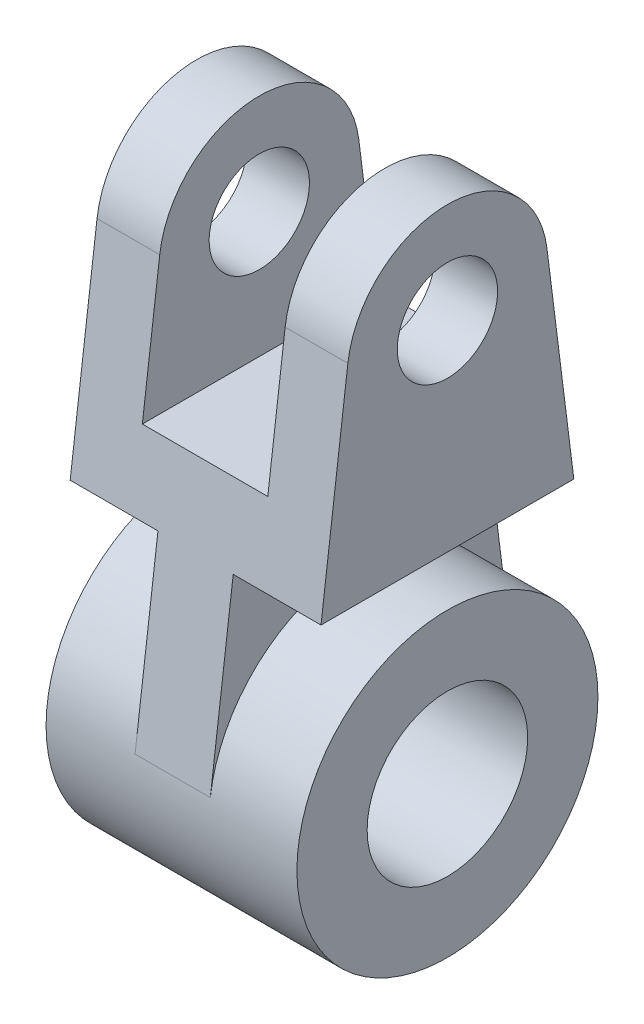
ISO-10303-21;
HEADER;
FILE_DESCRIPTION(('STEP AP214'),'2;1');
FILE_NAME('part.step','',(''),(''),'','','');
FILE_SCHEMA(('AUTOMOTIVE_DESIGN { 1 0 10303 214 1 1 1 1 }'));
ENDSEC;
DATA;
#1=APPLICATION_CONTEXT('core data for automotive mechanical design processes');
#2=APPLICATION_PROTOCOL_DEFINITION('international standard','automotive_design',2000,#1);
#3=PRODUCT_CONTEXT('',#1,'mechanical');
#4=PRODUCT('Part','Part','',(#3));
#5=PRODUCT_RELATED_PRODUCT_CATEGORY('part','',(#4));
#6=PRODUCT_DEFINITION_FORMATION('','',#4);
#7=PRODUCT_DEFINITION_CONTEXT('part definition',#1,'design');
#8=PRODUCT_DEFINITION('design','',#6,#7);
#9=PRODUCT_DEFINITION_SHAPE('','',#8);
#10=(LENGTH_UNIT() NAMED_UNIT(*) SI_UNIT(.MILLI.,.METRE.));
#11=(NAMED_UNIT(*) PLANE_ANGLE_UNIT() SI_UNIT($,.RADIAN.));
#12=(NAMED_UNIT(*) SI_UNIT($,.STERADIAN.) SOLID_ANGLE_UNIT());
#13=UNCERTAINTY_MEASURE_WITH_UNIT(LENGTH_MEASURE(1.E-05),#10,'distance_accuracy_value','');
#14=(GEOMETRIC_REPRESENTATION_CONTEXT(3) GLOBAL_UNCERTAINTY_ASSIGNED_CONTEXT((#13)) GLOBAL_UNIT_ASSIGNED_CONTEXT((#10,
#11,#12)) REPRESENTATION_CONTEXT('',''));
#15=CARTESIAN_POINT('',(0.,0.,0.));
#16=DIRECTION('',(0.,0.,1.));
#17=DIRECTION('',(1.,0.,0.));
#18=AXIS2_PLACEMENT_3D('',#15,#16,#17);
#19=CARTESIAN_POINT('',(25.,80.,0.));
#20=DIRECTION('',(-1.,0.,0.));
#21=DIRECTION('',(0.,0.,1.));
#22=AXIS2_PLACEMENT_3D('',#19,#20,#21);
#23=CYLINDRICAL_SURFACE('',#22,20.);
#24=DIRECTION('',(-1.,0.,0.));
#25=VECTOR('',#24,1.);
#26=CARTESIAN_POINT('',(25.,82.5,19.8431348329844));
#27=LINE('',#26,#25);
#28=CARTESIAN_POINT('',(-12.5,82.5,19.8431348329844));
#29=VERTEX_POINT('',#28);
#30=CARTESIAN_POINT('',(-25.,82.5,19.8431348329844));
#31=VERTEX_POINT('',#30);
#32=EDGE_CURVE('E193',#29,#31,#27,.T.);
#33=ORIENTED_EDGE('',*,*,#32,.F.);
#34=CARTESIAN_POINT('',(-12.5,80.,0.));
#35=DIRECTION('',(-1.,0.,0.));
#36=DIRECTION('',(0.,-1.,0.));
#37=AXIS2_PLACEMENT_3D('',#34,#35,#36);
#38=CIRCLE('',#37,20.);
#39=CARTESIAN_POINT('',(-12.5,82.5,-19.8431348329844));
#40=VERTEX_POINT('',#39);
#41=EDGE_CURVE('E151',#29,#40,#38,.T.);
#42=ORIENTED_EDGE('',*,*,#41,.T.);
#43=DIRECTION('',(-1.,0.,0.));
#44=VECTOR('',#43,1.);
#45=CARTESIAN_POINT('',(25.,82.5,-19.8431348329844));
#46=LINE('',#45,#44);
#47=CARTESIAN_POINT('',(-25.,82.5,-19.8431348329844));
#48=VERTEX_POINT('',#47);
#49=EDGE_CURVE('E146',#40,#48,#46,.T.);
#50=ORIENTED_EDGE('',*,*,#49,.T.);
#51=CARTESIAN_POINT('',(-25.,80.,0.));
#52=DIRECTION('',(1.,0.,0.));
#53=DIRECTION('',(0.,0.,-1.));
#54=AXIS2_PLACEMENT_3D('',#51,#52,#53);
#55=CIRCLE('',#54,20.);
#56=EDGE_CURVE('E178',#48,#31,#55,.T.);
#57=ORIENTED_EDGE('',*,*,#56,.T.);
#58=EDGE_LOOP('',(#33,#42,#50,#57));
#59=FACE_BOUND('',#58,.T.);
#60=ADVANCED_FACE('F35',(#59),#23,.T.);
#61=CARTESIAN_POINT('',(-25.,80.,0.));
#62=DIRECTION('',(1.,0.,0.));
#63=DIRECTION('',(0.,0.,-1.));
#64=AXIS2_PLACEMENT_3D('',#61,#62,#63);
#65=CYLINDRICAL_SURFACE('',#64,10.);
#66=CARTESIAN_POINT('',(12.5,80.,0.));
#67=DIRECTION('',(1.,0.,0.));
#68=DIRECTION('',(0.,1.,0.));
#69=AXIS2_PLACEMENT_3D('',#66,#67,#68);
#70=CIRCLE('',#69,10.);
#71=CARTESIAN_POINT('',(12.5,90.,0.));
#72=VERTEX_POINT('',#71);
#73=EDGE_CURVE('E147',#72,#72,#70,.F.);
#74=ORIENTED_EDGE('',*,*,#73,.T.);
#75=EDGE_LOOP('',(#74));
#76=FACE_BOUND('',#75,.T.);
#77=CARTESIAN_POINT('',(25.,80.,0.));
#78=DIRECTION('',(1.,0.,0.));
#79=DIRECTION('',(0.,0.,-1.));
#80=AXIS2_PLACEMENT_3D('',#77,#78,#79);
#81=CIRCLE('',#80,10.);
#82=CARTESIAN_POINT('',(25.,80.,-10.));
#83=VERTEX_POINT('',#82);
#84=EDGE_CURVE('E133',#83,#83,#81,.T.);
#85=ORIENTED_EDGE('',*,*,#84,.T.);
#86=EDGE_LOOP('',(#85));
#87=FACE_BOUND('',#86,.T.);
#88=ADVANCED_FACE('F279',(#76,#87),#65,.F.);
#89=CARTESIAN_POINT('',(25.,0.,0.));
#90=DIRECTION('',(-1.,0.,0.));
#91=DIRECTION('',(0.,0.,1.));
#92=AXIS2_PLACEMENT_3D('',#89,#90,#91);
#93=CYLINDRICAL_SURFACE('',#92,30.);
#94=DIRECTION('',(-1.,0.,0.));
#95=VECTOR('',#94,1.);
#96=CARTESIAN_POINT('',(7.5,3.75,-29.7647022494766));
#97=LINE('',#96,#95);
#98=CARTESIAN_POINT('',(7.5,3.75,-29.7647022494766));
#99=VERTEX_POINT('',#98);
#100=CARTESIAN_POINT('',(-7.5,3.75,-29.7647022494766));
#101=VERTEX_POINT('',#100);
#102=EDGE_CURVE('E50',#99,#101,#97,.T.);
#103=ORIENTED_EDGE('',*,*,#102,.F.);
#104=CARTESIAN_POINT('',(7.5,0.,0.));
#105=DIRECTION('',(1.,0.,0.));
#106=DIRECTION('',(0.,0.,-1.));
#107=AXIS2_PLACEMENT_3D('',#104,#105,#106);
#108=CIRCLE('',#107,30.);
#109=CARTESIAN_POINT('',(7.5,3.75,29.7647022494766));
#110=VERTEX_POINT('',#109);
#111=EDGE_CURVE('E55',#99,#110,#108,.T.);
#112=ORIENTED_EDGE('',*,*,#111,.T.);
#113=DIRECTION('',(-1.,0.,0.));
#114=VECTOR('',#113,1.);
#115=CARTESIAN_POINT('',(7.5,3.75,29.7647022494766));
#116=LINE('',#115,#114);
#117=CARTESIAN_POINT('',(-7.5,3.75,29.7647022494766));
#118=VERTEX_POINT('',#117);
#119=EDGE_CURVE('E210',#110,#118,#116,.T.);
#120=ORIENTED_EDGE('',*,*,#119,.T.);
#121=CARTESIAN_POINT('',(-7.5,0.,0.));
#122=DIRECTION('',(1.,0.,0.));
#123=DIRECTION('',(0.,0.,-1.));
#124=AXIS2_PLACEMENT_3D('',#121,#122,#123);
#125=CIRCLE('',#124,30.);
#126=EDGE_CURVE('E200',#101,#118,#125,.T.);
#127=ORIENTED_EDGE('',*,*,#126,.F.);
#128=EDGE_LOOP('',(#103,#112,#120,#127));
#129=FACE_BOUND('',#128,.T.);
#130=CARTESIAN_POINT('',(25.,0.,0.));
#131=DIRECTION('',(1.,0.,0.));
#132=DIRECTION('',(0.,0.,-1.));
#133=AXIS2_PLACEMENT_3D('',#130,#131,#132);
#134=CIRCLE('',#133,30.);
#135=CARTESIAN_POINT('',(25.,0.,-30.));
#136=VERTEX_POINT('',#135);
#137=EDGE_CURVE('E43',#136,#136,#134,.T.);
#138=ORIENTED_EDGE('',*,*,#137,.F.);
#139=EDGE_LOOP('',(#138));
#140=FACE_BOUND('',#139,.T.);
#141=CARTESIAN_POINT('',(-25.,0.,0.));
#142=DIRECTION('',(1.,0.,0.));
#143=DIRECTION('',(0.,0.,-1.));
#144=AXIS2_PLACEMENT_3D('',#141,#142,#143);
#145=CIRCLE('',#144,30.);
#146=CARTESIAN_POINT('',(-25.,0.,-30.));
#147=VERTEX_POINT('',#146);
#148=EDGE_CURVE('E226',#147,#147,#145,.T.);
#149=ORIENTED_EDGE('',*,*,#148,.T.);
#150=EDGE_LOOP('',(#149));
#151=FACE_BOUND('',#150,.T.);
#152=ADVANCED_FACE('F37',(#129,#140,#151),#93,.T.);
#153=CARTESIAN_POINT('',(25.,0.,0.));
#154=DIRECTION('',(1.,0.,0.));
#155=DIRECTION('',(0.,0.,-1.));
#156=AXIS2_PLACEMENT_3D('',#153,#154,#155);
#157=PLANE('',#156);
#158=CARTESIAN_POINT('',(25.,0.,0.));
#159=DIRECTION('',(1.,0.,0.));
#160=DIRECTION('',(0.,0.,-1.));
#161=AXIS2_PLACEMENT_3D('',#158,#159,#160);
#162=CIRCLE('',#161,16.);
#163=CARTESIAN_POINT('',(25.,0.,-16.));
#164=VERTEX_POINT('',#163);
#165=EDGE_CURVE('E222',#164,#164,#162,.T.);
#166=ORIENTED_EDGE('',*,*,#165,.F.);
#167=EDGE_LOOP('',(#166));
#168=FACE_BOUND('',#167,.T.);
#169=ORIENTED_EDGE('',*,*,#137,.T.);
#170=EDGE_LOOP('',(#169));
#171=FACE_BOUND('',#170,.T.);
#172=ADVANCED_FACE('F278',(#168,#171),#157,.T.);
#173=CARTESIAN_POINT('',(-25.,0.,0.));
#174=DIRECTION('',(1.,0.,0.));
#175=DIRECTION('',(0.,0.,-1.));
#176=AXIS2_PLACEMENT_3D('',#173,#174,#175);
#177=PLANE('',#176);
#178=CARTESIAN_POINT('',(-25.,0.,0.));
#179=DIRECTION('',(1.,0.,0.));
#180=DIRECTION('',(0.,0.,-1.));
#181=AXIS2_PLACEMENT_3D('',#178,#179,#180);
#182=CIRCLE('',#181,16.);
#183=CARTESIAN_POINT('',(-25.,0.,-16.));
#184=VERTEX_POINT('',#183);
#185=EDGE_CURVE('E223',#184,#184,#182,.T.);
#186=ORIENTED_EDGE('',*,*,#185,.T.);
#187=EDGE_LOOP('',(#186));
#188=FACE_BOUND('',#187,.T.);
#189=ORIENTED_EDGE('',*,*,#148,.F.);
#190=EDGE_LOOP('',(#189));
#191=FACE_BOUND('',#190,.T.);
#192=ADVANCED_FACE('F284',(#188,#191),#177,.F.);
#193=CARTESIAN_POINT('',(-25.,0.,0.));
#194=DIRECTION('',(1.,0.,0.));
#195=DIRECTION('',(0.,0.,-1.));
#196=AXIS2_PLACEMENT_3D('',#193,#194,#195);
#197=CYLINDRICAL_SURFACE('',#196,16.);
#198=ORIENTED_EDGE('',*,*,#185,.F.);
#199=EDGE_LOOP('',(#198));
#200=FACE_BOUND('',#199,.T.);
#201=ORIENTED_EDGE('',*,*,#165,.T.);
#202=EDGE_LOOP('',(#201));
#203=FACE_BOUND('',#202,.T.);
#204=ADVANCED_FACE('F286',(#200,#203),#197,.F.);
#205=CARTESIAN_POINT('',(7.5,3.75,-29.7647022494766));
#206=DIRECTION('',(0.,-0.125,0.992156741649222));
#207=DIRECTION('',(0.,-0.992156741649222,-0.125));
#208=AXIS2_PLACEMENT_3D('',#205,#206,#207);
#209=PLANE('',#208);
#210=DIRECTION('',(1.,0.,0.));
#211=VECTOR('',#210,1.);
#212=CARTESIAN_POINT('',(7.5,55.,-23.3078091689023));
#213=LINE('',#212,#211);
#214=CARTESIAN_POINT('',(-12.5,55.,-23.3078091689023));
#215=VERTEX_POINT('',#214);
#216=CARTESIAN_POINT('',(12.5,55.,-23.3078091689023));
#217=VERTEX_POINT('',#216);
#218=EDGE_CURVE('E124',#215,#217,#213,.T.);
#219=ORIENTED_EDGE('',*,*,#218,.T.);
#220=DIRECTION('',(0.,0.992156741649222,0.125));
#221=VECTOR('',#220,1.);
#222=CARTESIAN_POINT('',(12.5,3.75,-29.7647022494766));
#223=LINE('',#222,#221);
#224=CARTESIAN_POINT('',(12.5,82.5,-19.8431348329844));
#225=VERTEX_POINT('',#224);
#226=EDGE_CURVE('E134',#217,#225,#223,.T.);
#227=ORIENTED_EDGE('',*,*,#226,.T.);
#228=CARTESIAN_POINT('',(25.,82.5,-19.8431348329844));
#229=VERTEX_POINT('',#228);
#230=EDGE_CURVE('E197',#229,#225,#46,.T.);
#231=ORIENTED_EDGE('',*,*,#230,.F.);
#232=DIRECTION('',(0.,0.992156741649222,0.125));
#233=VECTOR('',#232,1.);
#234=CARTESIAN_POINT('',(25.,3.75,-29.7647022494766));
#235=LINE('',#234,#233);
#236=CARTESIAN_POINT('',(25.,40.,-25.1976315339485));
#237=VERTEX_POINT('',#236);
#238=EDGE_CURVE('E166',#237,#229,#235,.T.);
#239=ORIENTED_EDGE('',*,*,#238,.F.);
#240=DIRECTION('',(-1.,0.,0.));
#241=VECTOR('',#240,1.);
#242=CARTESIAN_POINT('',(25.,40.,-25.1976315339485));
#243=LINE('',#242,#241);
#244=CARTESIAN_POINT('',(7.5,40.,-25.1976315339485));
#245=VERTEX_POINT('',#244);
#246=EDGE_CURVE('E186',#237,#245,#243,.T.);
#247=ORIENTED_EDGE('',*,*,#246,.T.);
#248=DIRECTION('',(0.,0.992156741649222,0.125));
#249=VECTOR('',#248,1.);
#250=CARTESIAN_POINT('',(7.5,3.75,-29.7647022494766));
#251=LINE('',#250,#249);
#252=EDGE_CURVE('E202',#99,#245,#251,.T.);
#253=ORIENTED_EDGE('',*,*,#252,.F.);
#254=ORIENTED_EDGE('',*,*,#102,.T.);
#255=DIRECTION('',(0.,0.992156741649222,0.125));
#256=VECTOR('',#255,1.);
#257=CARTESIAN_POINT('',(-7.5,3.75,-29.7647022494766));
#258=LINE('',#257,#256);
#259=CARTESIAN_POINT('',(-7.5,40.,-25.1976315339485));
#260=VERTEX_POINT('',#259);
#261=EDGE_CURVE('E213',#101,#260,#258,.T.);
#262=ORIENTED_EDGE('',*,*,#261,.T.);
#263=CARTESIAN_POINT('',(-25.,40.,-25.1976315339485));
#264=VERTEX_POINT('',#263);
#265=EDGE_CURVE('E176',#260,#264,#243,.T.);
#266=ORIENTED_EDGE('',*,*,#265,.T.);
#267=DIRECTION('',(0.,0.992156741649222,0.125));
#268=VECTOR('',#267,1.);
#269=CARTESIAN_POINT('',(-25.,3.75,-29.7647022494766));
#270=LINE('',#269,#268);
#271=EDGE_CURVE('E163',#264,#48,#270,.T.);
#272=ORIENTED_EDGE('',*,*,#271,.T.);
#273=ORIENTED_EDGE('',*,*,#49,.F.);
#274=DIRECTION('',(0.,-0.992156741649222,-0.125));
#275=VECTOR('',#274,1.);
#276=CARTESIAN_POINT('',(-12.5,3.74999999999999,-29.7647022494766));
#277=LINE('',#276,#275);
#278=EDGE_CURVE('E138',#40,#215,#277,.T.);
#279=ORIENTED_EDGE('',*,*,#278,.T.);
#280=EDGE_LOOP('',(#219,#227,#231,#239,#247,#253,#254,#262,#266,#272,#273,#279));
#281=FACE_BOUND('',#280,.T.);
#282=ADVANCED_FACE('F144',(#281),#209,.F.);
#283=CARTESIAN_POINT('',(7.5,3.75,29.7647022494766));
#284=DIRECTION('',(0.,-0.125,-0.992156741649222));
#285=DIRECTION('',(0.,0.992156741649222,-0.125));
#286=AXIS2_PLACEMENT_3D('',#283,#284,#285);
#287=PLANE('',#286);
#288=CARTESIAN_POINT('',(25.,82.5,19.8431348329844));
#289=VERTEX_POINT('',#288);
#290=CARTESIAN_POINT('',(12.5,82.5,19.8431348329844));
#291=VERTEX_POINT('',#290);
#292=EDGE_CURVE('E194',#289,#291,#27,.T.);
#293=ORIENTED_EDGE('',*,*,#292,.T.);
#294=DIRECTION('',(0.,-0.992156741649222,0.125));
#295=VECTOR('',#294,1.);
#296=CARTESIAN_POINT('',(12.5,3.75,29.7647022494766));
#297=LINE('',#296,#295);
#298=CARTESIAN_POINT('',(12.5,55.,23.3078091689023));
#299=VERTEX_POINT('',#298);
#300=EDGE_CURVE('E156',#291,#299,#297,.T.);
#301=ORIENTED_EDGE('',*,*,#300,.T.);
#302=DIRECTION('',(-1.,0.,0.));
#303=VECTOR('',#302,1.);
#304=CARTESIAN_POINT('',(7.5,55.,23.3078091689023));
#305=LINE('',#304,#303);
#306=CARTESIAN_POINT('',(-12.5,55.,23.3078091689023));
#307=VERTEX_POINT('',#306);
#308=EDGE_CURVE('E11',#299,#307,#305,.T.);
#309=ORIENTED_EDGE('',*,*,#308,.T.);
#310=DIRECTION('',(0.,0.992156741649222,-0.125));
#311=VECTOR('',#310,1.);
#312=CARTESIAN_POINT('',(-12.5,3.74999999999999,29.7647022494766));
#313=LINE('',#312,#311);
#314=EDGE_CURVE('E141',#307,#29,#313,.T.);
#315=ORIENTED_EDGE('',*,*,#314,.T.);
#316=ORIENTED_EDGE('',*,*,#32,.T.);
#317=DIRECTION('',(0.,-0.992156741649222,0.125));
#318=VECTOR('',#317,1.);
#319=CARTESIAN_POINT('',(-25.,3.75,29.7647022494766));
#320=LINE('',#319,#318);
#321=CARTESIAN_POINT('',(-25.,40.,25.1976315339485));
#322=VERTEX_POINT('',#321);
#323=EDGE_CURVE('E181',#31,#322,#320,.T.);
#324=ORIENTED_EDGE('',*,*,#323,.T.);
#325=DIRECTION('',(-1.,0.,0.));
#326=VECTOR('',#325,1.);
#327=CARTESIAN_POINT('',(25.,40.,25.1976315339485));
#328=LINE('',#327,#326);
#329=CARTESIAN_POINT('',(-7.5,40.,25.1976315339485));
#330=VERTEX_POINT('',#329);
#331=EDGE_CURVE('E189',#330,#322,#328,.T.);
#332=ORIENTED_EDGE('',*,*,#331,.F.);
#333=DIRECTION('',(0.,-0.992156741649222,0.125));
#334=VECTOR('',#333,1.);
#335=CARTESIAN_POINT('',(-7.5,3.75,29.7647022494766));
#336=LINE('',#335,#334);
#337=EDGE_CURVE('E203',#330,#118,#336,.T.);
#338=ORIENTED_EDGE('',*,*,#337,.T.);
#339=ORIENTED_EDGE('',*,*,#119,.F.);
#340=DIRECTION('',(0.,-0.992156741649222,0.125));
#341=VECTOR('',#340,1.);
#342=CARTESIAN_POINT('',(7.5,3.75,29.7647022494766));
#343=LINE('',#342,#341);
#344=CARTESIAN_POINT('',(7.5,40.,25.1976315339485));
#345=VERTEX_POINT('',#344);
#346=EDGE_CURVE('E208',#345,#110,#343,.T.);
#347=ORIENTED_EDGE('',*,*,#346,.F.);
#348=CARTESIAN_POINT('',(25.,40.,25.1976315339485));
#349=VERTEX_POINT('',#348);
#350=EDGE_CURVE('E190',#349,#345,#328,.T.);
#351=ORIENTED_EDGE('',*,*,#350,.F.);
#352=DIRECTION('',(0.,-0.992156741649222,0.125));
#353=VECTOR('',#352,1.);
#354=CARTESIAN_POINT('',(25.,3.75,29.7647022494766));
#355=LINE('',#354,#353);
#356=EDGE_CURVE('E172',#289,#349,#355,.T.);
#357=ORIENTED_EDGE('',*,*,#356,.F.);
#358=EDGE_LOOP('',(#293,#301,#309,#315,#316,#324,#332,#338,#339,#347,#351,#357));
#359=FACE_BOUND('',#358,.T.);
#360=ADVANCED_FACE('F242',(#359),#287,.F.);
#361=CARTESIAN_POINT('',(7.5,0.,0.));
#362=DIRECTION('',(1.,0.,0.));
#363=DIRECTION('',(0.,0.,-1.));
#364=AXIS2_PLACEMENT_3D('',#361,#362,#363);
#365=PLANE('',#364);
#366=ORIENTED_EDGE('',*,*,#111,.F.);
#367=ORIENTED_EDGE('',*,*,#252,.T.);
#368=DIRECTION('',(0.,0.,-1.));
#369=VECTOR('',#368,1.);
#370=CARTESIAN_POINT('',(7.5,40.,0.));
#371=LINE('',#370,#369);
#372=EDGE_CURVE('E205',#345,#245,#371,.T.);
#373=ORIENTED_EDGE('',*,*,#372,.F.);
#374=ORIENTED_EDGE('',*,*,#346,.T.);
#375=EDGE_LOOP('',(#366,#367,#373,#374));
#376=FACE_BOUND('',#375,.T.);
#377=ADVANCED_FACE('F258',(#376),#365,.T.);
#378=CARTESIAN_POINT('',(-7.5,0.,0.));
#379=DIRECTION('',(1.,0.,0.));
#380=DIRECTION('',(0.,0.,-1.));
#381=AXIS2_PLACEMENT_3D('',#378,#379,#380);
#382=PLANE('',#381);
#383=ORIENTED_EDGE('',*,*,#126,.T.);
#384=ORIENTED_EDGE('',*,*,#337,.F.);
#385=DIRECTION('',(0.,0.,-1.));
#386=VECTOR('',#385,1.);
#387=CARTESIAN_POINT('',(-7.5,40.,0.));
#388=LINE('',#387,#386);
#389=EDGE_CURVE('E215',#330,#260,#388,.T.);
#390=ORIENTED_EDGE('',*,*,#389,.T.);
#391=ORIENTED_EDGE('',*,*,#261,.F.);
#392=EDGE_LOOP('',(#383,#384,#390,#391));
#393=FACE_BOUND('',#392,.T.);
#394=ADVANCED_FACE('F262',(#393),#382,.F.);
#395=CARTESIAN_POINT('',(25.,40.,0.));
#396=DIRECTION('',(0.,1.,0.));
#397=DIRECTION('',(0.,0.,1.));
#398=AXIS2_PLACEMENT_3D('',#395,#396,#397);
#399=PLANE('',#398);
#400=ORIENTED_EDGE('',*,*,#350,.T.);
#401=ORIENTED_EDGE('',*,*,#372,.T.);
#402=ORIENTED_EDGE('',*,*,#246,.F.);
#403=DIRECTION('',(0.,0.,-1.));
#404=VECTOR('',#403,1.);
#405=CARTESIAN_POINT('',(25.,40.,0.));
#406=LINE('',#405,#404);
#407=EDGE_CURVE('E174',#349,#237,#406,.T.);
#408=ORIENTED_EDGE('',*,*,#407,.F.);
#409=EDGE_LOOP('',(#400,#401,#402,#408));
#410=FACE_BOUND('',#409,.T.);
#411=ADVANCED_FACE('F255',(#410),#399,.F.);
#412=CARTESIAN_POINT('',(12.5,80.,0.));
#413=DIRECTION('',(1.,0.,0.));
#414=DIRECTION('',(0.,1.,0.));
#415=AXIS2_PLACEMENT_3D('',#412,#413,#414);
#416=CIRCLE('',#415,20.);
#417=EDGE_CURVE('E150',#225,#291,#416,.T.);
#418=ORIENTED_EDGE('',*,*,#417,.T.);
#419=ORIENTED_EDGE('',*,*,#292,.F.);
#420=CARTESIAN_POINT('',(25.,80.,0.));
#421=DIRECTION('',(1.,0.,0.));
#422=DIRECTION('',(0.,0.,-1.));
#423=AXIS2_PLACEMENT_3D('',#420,#421,#422);
#424=CIRCLE('',#423,20.);
#425=EDGE_CURVE('E169',#229,#289,#424,.T.);
#426=ORIENTED_EDGE('',*,*,#425,.F.);
#427=ORIENTED_EDGE('',*,*,#230,.T.);
#428=EDGE_LOOP('',(#418,#419,#426,#427));
#429=FACE_BOUND('',#428,.T.);
#430=ADVANCED_FACE('F247',(#429),#23,.T.);
#431=ORIENTED_EDGE('',*,*,#389,.F.);
#432=ORIENTED_EDGE('',*,*,#331,.T.);
#433=DIRECTION('',(0.,0.,-1.));
#434=VECTOR('',#433,1.);
#435=CARTESIAN_POINT('',(-25.,40.,0.));
#436=LINE('',#435,#434);
#437=EDGE_CURVE('E170',#322,#264,#436,.T.);
#438=ORIENTED_EDGE('',*,*,#437,.T.);
#439=ORIENTED_EDGE('',*,*,#265,.F.);
#440=EDGE_LOOP('',(#431,#432,#438,#439));
#441=FACE_BOUND('',#440,.T.);
#442=ADVANCED_FACE('F267',(#441),#399,.F.);
#443=CARTESIAN_POINT('',(25.,0.,0.));
#444=DIRECTION('',(1.,0.,0.));
#445=DIRECTION('',(0.,0.,-1.));
#446=AXIS2_PLACEMENT_3D('',#443,#444,#445);
#447=PLANE('',#446);
#448=ORIENTED_EDGE('',*,*,#84,.F.);
#449=EDGE_LOOP('',(#448));
#450=FACE_BOUND('',#449,.T.);
#451=ORIENTED_EDGE('',*,*,#238,.T.);
#452=ORIENTED_EDGE('',*,*,#425,.T.);
#453=ORIENTED_EDGE('',*,*,#356,.T.);
#454=ORIENTED_EDGE('',*,*,#407,.T.);
#455=EDGE_LOOP('',(#451,#452,#453,#454));
#456=FACE_BOUND('',#455,.T.);
#457=ADVANCED_FACE('F252',(#450,#456),#447,.T.);
#458=CARTESIAN_POINT('',(-25.,0.,0.));
#459=DIRECTION('',(1.,0.,0.));
#460=DIRECTION('',(0.,0.,-1.));
#461=AXIS2_PLACEMENT_3D('',#458,#459,#460);
#462=PLANE('',#461);
#463=CARTESIAN_POINT('',(-25.,80.,0.));
#464=DIRECTION('',(1.,0.,0.));
#465=DIRECTION('',(0.,0.,-1.));
#466=AXIS2_PLACEMENT_3D('',#463,#464,#465);
#467=CIRCLE('',#466,10.);
#468=CARTESIAN_POINT('',(-25.,80.,-10.));
#469=VERTEX_POINT('',#468);
#470=EDGE_CURVE('E160',#469,#469,#467,.T.);
#471=ORIENTED_EDGE('',*,*,#470,.T.);
#472=EDGE_LOOP('',(#471));
#473=FACE_BOUND('',#472,.T.);
#474=ORIENTED_EDGE('',*,*,#271,.F.);
#475=ORIENTED_EDGE('',*,*,#437,.F.);
#476=ORIENTED_EDGE('',*,*,#323,.F.);
#477=ORIENTED_EDGE('',*,*,#56,.F.);
#478=EDGE_LOOP('',(#474,#475,#476,#477));
#479=FACE_BOUND('',#478,.T.);
#480=ADVANCED_FACE('F272',(#473,#479),#462,.F.);
#481=CARTESIAN_POINT('',(-12.5,80.,0.));
#482=DIRECTION('',(-1.,0.,0.));
#483=DIRECTION('',(0.,-1.,0.));
#484=AXIS2_PLACEMENT_3D('',#481,#482,#483);
#485=CIRCLE('',#484,10.);
#486=CARTESIAN_POINT('',(-12.5,70.,0.));
#487=VERTEX_POINT('',#486);
#488=EDGE_CURVE('E233',#487,#487,#485,.F.);
#489=ORIENTED_EDGE('',*,*,#488,.T.);
#490=EDGE_LOOP('',(#489));
#491=FACE_BOUND('',#490,.T.);
#492=ORIENTED_EDGE('',*,*,#470,.F.);
#493=EDGE_LOOP('',(#492));
#494=FACE_BOUND('',#493,.T.);
#495=ADVANCED_FACE('F303',(#491,#494),#65,.F.);
#496=CARTESIAN_POINT('',(12.5,55.,-30.));
#497=DIRECTION('',(0.,-1.,0.));
#498=DIRECTION('',(0.,0.,-1.));
#499=AXIS2_PLACEMENT_3D('',#496,#497,#498);
#500=PLANE('',#499);
#501=DIRECTION('',(0.,0.,1.));
#502=VECTOR('',#501,1.);
#503=CARTESIAN_POINT('',(-12.5,55.,-30.));
#504=LINE('',#503,#502);
#505=EDGE_CURVE('E127',#215,#307,#504,.T.);
#506=ORIENTED_EDGE('',*,*,#505,.T.);
#507=ORIENTED_EDGE('',*,*,#308,.F.);
#508=DIRECTION('',(0.,0.,1.));
#509=VECTOR('',#508,1.);
#510=CARTESIAN_POINT('',(12.5,55.,-30.));
#511=LINE('',#510,#509);
#512=EDGE_CURVE('E129',#217,#299,#511,.T.);
#513=ORIENTED_EDGE('',*,*,#512,.F.);
#514=ORIENTED_EDGE('',*,*,#218,.F.);
#515=EDGE_LOOP('',(#506,#507,#513,#514));
#516=FACE_BOUND('',#515,.T.);
#517=ADVANCED_FACE('F126',(#516),#500,.F.);
#518=CARTESIAN_POINT('',(12.5,100.,-30.));
#519=DIRECTION('',(1.,0.,0.));
#520=DIRECTION('',(0.,1.,0.));
#521=AXIS2_PLACEMENT_3D('',#518,#519,#520);
#522=PLANE('',#521);
#523=ORIENTED_EDGE('',*,*,#73,.F.);
#524=EDGE_LOOP('',(#523));
#525=FACE_BOUND('',#524,.T.);
#526=ORIENTED_EDGE('',*,*,#512,.T.);
#527=ORIENTED_EDGE('',*,*,#300,.F.);
#528=ORIENTED_EDGE('',*,*,#417,.F.);
#529=ORIENTED_EDGE('',*,*,#226,.F.);
#530=EDGE_LOOP('',(#526,#527,#528,#529));
#531=FACE_BOUND('',#530,.T.);
#532=ADVANCED_FACE('F240',(#525,#531),#522,.F.);
#533=CARTESIAN_POINT('',(-12.5,100.,-30.));
#534=DIRECTION('',(-1.,0.,0.));
#535=DIRECTION('',(0.,-1.,0.));
#536=AXIS2_PLACEMENT_3D('',#533,#534,#535);
#537=PLANE('',#536);
#538=ORIENTED_EDGE('',*,*,#488,.F.);
#539=EDGE_LOOP('',(#538));
#540=FACE_BOUND('',#539,.T.);
#541=ORIENTED_EDGE('',*,*,#41,.F.);
#542=ORIENTED_EDGE('',*,*,#314,.F.);
#543=ORIENTED_EDGE('',*,*,#505,.F.);
#544=ORIENTED_EDGE('',*,*,#278,.F.);
#545=EDGE_LOOP('',(#541,#542,#543,#544));
#546=FACE_BOUND('',#545,.T.);
#547=ADVANCED_FACE('F137',(#540,#546),#537,.F.);
#548=CLOSED_SHELL('',(#60,#88,#152,#172,#192,#204,#282,#360,#377,#394,#411,#430,#442,#457,#480,
#495,#517,#532,#547));
#549=MANIFOLD_SOLID_BREP('B2',#548);
#550=ADVANCED_BREP_SHAPE_REPRESENTATION('',(#18,#549),#14);
#551=SHAPE_DEFINITION_REPRESENTATION(#9,#550);
ENDSEC;
END-ISO-10303-21;
